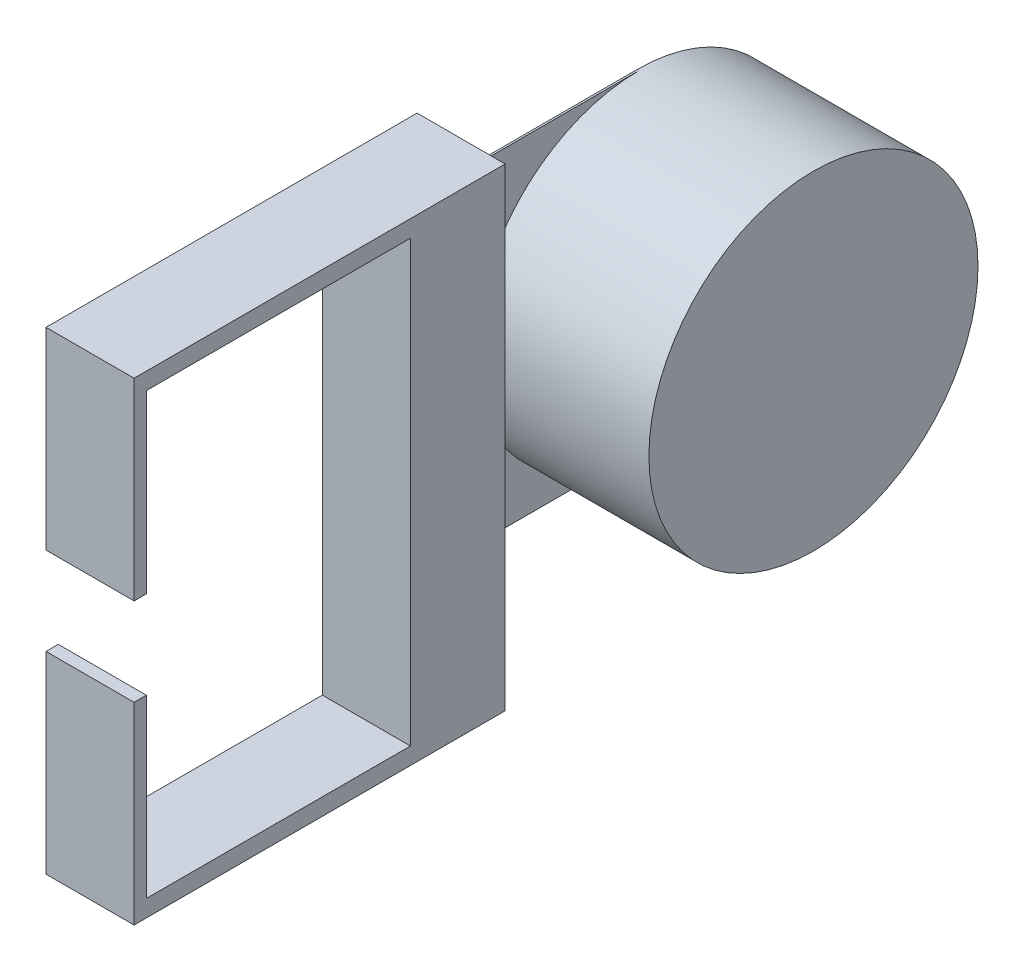
ISO-10303-21;
HEADER;
FILE_DESCRIPTION(('STEP AP214'),'2;1');
FILE_NAME('part.step','',(''),(''),'','','');
FILE_SCHEMA(('AUTOMOTIVE_DESIGN { 1 0 10303 214 1 1 1 1 }'));
ENDSEC;
DATA;
#1=APPLICATION_CONTEXT('core data for automotive mechanical design processes');
#2=APPLICATION_PROTOCOL_DEFINITION('international standard','automotive_design',2000,#1);
#3=PRODUCT_CONTEXT('',#1,'mechanical');
#4=PRODUCT('Part','Part','',(#3));
#5=PRODUCT_RELATED_PRODUCT_CATEGORY('part','',(#4));
#6=PRODUCT_DEFINITION_FORMATION('','',#4);
#7=PRODUCT_DEFINITION_CONTEXT('part definition',#1,'design');
#8=PRODUCT_DEFINITION('design','',#6,#7);
#9=PRODUCT_DEFINITION_SHAPE('','',#8);
#10=(LENGTH_UNIT() NAMED_UNIT(*) SI_UNIT(.MILLI.,.METRE.));
#11=(NAMED_UNIT(*) PLANE_ANGLE_UNIT() SI_UNIT($,.RADIAN.));
#12=(NAMED_UNIT(*) SI_UNIT($,.STERADIAN.) SOLID_ANGLE_UNIT());
#13=UNCERTAINTY_MEASURE_WITH_UNIT(LENGTH_MEASURE(1.E-05),#10,'distance_accuracy_value','');
#14=(GEOMETRIC_REPRESENTATION_CONTEXT(3) GLOBAL_UNCERTAINTY_ASSIGNED_CONTEXT((#13)) GLOBAL_UNIT_ASSIGNED_CONTEXT((#10,
#11,#12)) REPRESENTATION_CONTEXT('',''));
#15=CARTESIAN_POINT('',(0.,0.,0.));
#16=DIRECTION('',(0.,0.,1.));
#17=DIRECTION('',(1.,0.,0.));
#18=AXIS2_PLACEMENT_3D('',#15,#16,#17);
#19=CARTESIAN_POINT('',(25.4,0.,0.));
#20=DIRECTION('',(-1.,0.,0.));
#21=DIRECTION('',(0.,0.,1.));
#22=AXIS2_PLACEMENT_3D('',#19,#20,#21);
#23=CYLINDRICAL_SURFACE('',#22,23.72487);
#24=CARTESIAN_POINT('',(25.4,0.,0.));
#25=DIRECTION('',(1.,0.,0.));
#26=DIRECTION('',(0.,0.,-1.));
#27=AXIS2_PLACEMENT_3D('',#24,#25,#26);
#28=CIRCLE('',#27,23.72487);
#29=CARTESIAN_POINT('',(25.4,0.,-23.72487));
#30=VERTEX_POINT('',#29);
#31=EDGE_CURVE('E48',#30,#30,#28,.T.);
#32=ORIENTED_EDGE('',*,*,#31,.F.);
#33=EDGE_LOOP('',(#32));
#34=FACE_BOUND('',#33,.T.);
#35=DIRECTION('',(-1.,0.,0.));
#36=VECTOR('',#35,1.);
#37=CARTESIAN_POINT('',(0.,23.72487,0.));
#38=LINE('',#37,#36);
#39=CARTESIAN_POINT('',(0.271779999999999,23.72487,0.));
#40=VERTEX_POINT('',#39);
#41=CARTESIAN_POINT('',(0.,23.72487,0.));
#42=VERTEX_POINT('',#41);
#43=EDGE_CURVE('E293',#40,#42,#38,.T.);
#44=ORIENTED_EDGE('',*,*,#43,.F.);
#45=CARTESIAN_POINT('',(0.271779999999999,0.,0.));
#46=DIRECTION('',(-1.,0.,0.));
#47=DIRECTION('',(0.,0.,1.));
#48=AXIS2_PLACEMENT_3D('',#45,#46,#47);
#49=CIRCLE('',#48,23.72487);
#50=CARTESIAN_POINT('',(0.271779999999999,-23.72487,0.));
#51=VERTEX_POINT('',#50);
#52=EDGE_CURVE('E11',#51,#40,#49,.T.);
#53=ORIENTED_EDGE('',*,*,#52,.F.);
#54=DIRECTION('',(1.,0.,0.));
#55=VECTOR('',#54,1.);
#56=CARTESIAN_POINT('',(0.,-23.72487,0.));
#57=LINE('',#56,#55);
#58=CARTESIAN_POINT('',(0.,-23.72487,0.));
#59=VERTEX_POINT('',#58);
#60=EDGE_CURVE('E283',#59,#51,#57,.T.);
#61=ORIENTED_EDGE('',*,*,#60,.F.);
#62=CARTESIAN_POINT('',(0.,0.,0.));
#63=DIRECTION('',(1.,0.,0.));
#64=DIRECTION('',(0.,0.,-1.));
#65=AXIS2_PLACEMENT_3D('',#62,#63,#64);
#66=CIRCLE('',#65,23.72487);
#67=EDGE_CURVE('E322',#59,#42,#66,.T.);
#68=ORIENTED_EDGE('',*,*,#67,.T.);
#69=EDGE_LOOP('',(#44,#53,#61,#68));
#70=FACE_BOUND('',#69,.T.);
#71=ADVANCED_FACE('F37',(#34,#70),#23,.T.);
#72=CARTESIAN_POINT('',(25.4,0.,0.));
#73=DIRECTION('',(1.,0.,0.));
#74=DIRECTION('',(0.,0.,-1.));
#75=AXIS2_PLACEMENT_3D('',#72,#73,#74);
#76=PLANE('',#75);
#77=ORIENTED_EDGE('',*,*,#31,.T.);
#78=EDGE_LOOP('',(#77));
#79=FACE_BOUND('',#78,.T.);
#80=ADVANCED_FACE('F399',(#79),#76,.T.);
#81=CARTESIAN_POINT('',(0.,0.,0.));
#82=DIRECTION('',(1.,0.,0.));
#83=DIRECTION('',(0.,0.,-1.));
#84=AXIS2_PLACEMENT_3D('',#81,#82,#83);
#85=PLANE('',#84);
#86=ORIENTED_EDGE('',*,*,#67,.F.);
#87=DIRECTION('',(0.,0.,-1.));
#88=VECTOR('',#87,1.);
#89=CARTESIAN_POINT('',(0.,-23.72487,31.75));
#90=LINE('',#89,#88);
#91=CARTESIAN_POINT('',(0.,-23.72487,31.75));
#92=VERTEX_POINT('',#91);
#93=EDGE_CURVE('E299',#92,#59,#90,.T.);
#94=ORIENTED_EDGE('',*,*,#93,.F.);
#95=DIRECTION('',(0.,-1.,0.));
#96=VECTOR('',#95,1.);
#97=CARTESIAN_POINT('',(0.,34.14141,31.75));
#98=LINE('',#97,#96);
#99=CARTESIAN_POINT('',(0.,-34.14141,31.75));
#100=VERTEX_POINT('',#99);
#101=EDGE_CURVE('E262',#92,#100,#98,.T.);
#102=ORIENTED_EDGE('',*,*,#101,.T.);
#103=DIRECTION('',(0.,0.,-1.));
#104=VECTOR('',#103,1.);
#105=CARTESIAN_POINT('',(0.,-34.14141,45.40758));
#106=LINE('',#105,#104);
#107=CARTESIAN_POINT('',(0.,-34.14141,85.25256));
#108=VERTEX_POINT('',#107);
#109=EDGE_CURVE('E279',#108,#100,#106,.T.);
#110=ORIENTED_EDGE('',*,*,#109,.F.);
#111=DIRECTION('',(0.,-1.,0.));
#112=VECTOR('',#111,1.);
#113=CARTESIAN_POINT('',(0.,-34.14141,85.25256));
#114=LINE('',#113,#112);
#115=CARTESIAN_POINT('',(0.,-6.32586999999999,85.25256));
#116=VERTEX_POINT('',#115);
#117=EDGE_CURVE('E210',#116,#108,#114,.T.);
#118=ORIENTED_EDGE('',*,*,#117,.F.);
#119=DIRECTION('',(0.,0.,-1.));
#120=VECTOR('',#119,1.);
#121=CARTESIAN_POINT('',(0.,-6.32586999999999,85.25256));
#122=LINE('',#121,#120);
#123=CARTESIAN_POINT('',(0.,-6.32586999999999,83.48218));
#124=VERTEX_POINT('',#123);
#125=EDGE_CURVE('E199',#116,#124,#122,.T.);
#126=ORIENTED_EDGE('',*,*,#125,.T.);
#127=DIRECTION('',(0.,-1.,0.));
#128=VECTOR('',#127,1.);
#129=CARTESIAN_POINT('',(0.,-34.14141,83.48218));
#130=LINE('',#129,#128);
#131=CARTESIAN_POINT('',(0.,-31.70555,83.48218));
#132=VERTEX_POINT('',#131);
#133=EDGE_CURVE('E208',#124,#132,#130,.T.);
#134=ORIENTED_EDGE('',*,*,#133,.T.);
#135=DIRECTION('',(0.,0.,-1.));
#136=VECTOR('',#135,1.);
#137=CARTESIAN_POINT('',(0.,-31.70555,83.48218));
#138=LINE('',#137,#136);
#139=CARTESIAN_POINT('',(0.,-31.70555,45.40758));
#140=VERTEX_POINT('',#139);
#141=EDGE_CURVE('E186',#132,#140,#138,.T.);
#142=ORIENTED_EDGE('',*,*,#141,.T.);
#143=DIRECTION('',(0.,-1.,0.));
#144=VECTOR('',#143,1.);
#145=CARTESIAN_POINT('',(0.,34.14141,45.40758));
#146=LINE('',#145,#144);
#147=CARTESIAN_POINT('',(0.,31.70555,45.40758));
#148=VERTEX_POINT('',#147);
#149=EDGE_CURVE('E249',#148,#140,#146,.T.);
#150=ORIENTED_EDGE('',*,*,#149,.F.);
#151=DIRECTION('',(0.,0.,-1.));
#152=VECTOR('',#151,1.);
#153=CARTESIAN_POINT('',(0.,31.70555,83.48218));
#154=LINE('',#153,#152);
#155=CARTESIAN_POINT('',(0.,31.70555,83.48218));
#156=VERTEX_POINT('',#155);
#157=EDGE_CURVE('E236',#156,#148,#154,.T.);
#158=ORIENTED_EDGE('',*,*,#157,.F.);
#159=DIRECTION('',(0.,-1.,0.));
#160=VECTOR('',#159,1.);
#161=CARTESIAN_POINT('',(0.,34.14141,83.48218));
#162=LINE('',#161,#160);
#163=CARTESIAN_POINT('',(0.,6.32586999999999,83.48218));
#164=VERTEX_POINT('',#163);
#165=EDGE_CURVE('E179',#156,#164,#162,.T.);
#166=ORIENTED_EDGE('',*,*,#165,.T.);
#167=DIRECTION('',(0.,0.,-1.));
#168=VECTOR('',#167,1.);
#169=CARTESIAN_POINT('',(0.,6.32586999999999,85.25256));
#170=LINE('',#169,#168);
#171=CARTESIAN_POINT('',(0.,6.32586999999999,85.25256));
#172=VERTEX_POINT('',#171);
#173=EDGE_CURVE('E159',#172,#164,#170,.T.);
#174=ORIENTED_EDGE('',*,*,#173,.F.);
#175=DIRECTION('',(0.,-1.,0.));
#176=VECTOR('',#175,1.);
#177=CARTESIAN_POINT('',(0.,34.14141,85.25256));
#178=LINE('',#177,#176);
#179=CARTESIAN_POINT('',(0.,34.14141,85.25256));
#180=VERTEX_POINT('',#179);
#181=EDGE_CURVE('E165',#180,#172,#178,.T.);
#182=ORIENTED_EDGE('',*,*,#181,.F.);
#183=DIRECTION('',(0.,0.,-1.));
#184=VECTOR('',#183,1.);
#185=CARTESIAN_POINT('',(0.,34.14141,45.40758));
#186=LINE('',#185,#184);
#187=CARTESIAN_POINT('',(0.,34.14141,31.75));
#188=VERTEX_POINT('',#187);
#189=EDGE_CURVE('E285',#180,#188,#186,.T.);
#190=ORIENTED_EDGE('',*,*,#189,.T.);
#191=CARTESIAN_POINT('',(0.,23.72487,31.75));
#192=VERTEX_POINT('',#191);
#193=EDGE_CURVE('E265',#188,#192,#98,.T.);
#194=ORIENTED_EDGE('',*,*,#193,.T.);
#195=DIRECTION('',(0.,0.,-1.));
#196=VECTOR('',#195,1.);
#197=CARTESIAN_POINT('',(0.,23.72487,31.75));
#198=LINE('',#197,#196);
#199=EDGE_CURVE('E307',#192,#42,#198,.T.);
#200=ORIENTED_EDGE('',*,*,#199,.T.);
#201=EDGE_LOOP('',(#86,#94,#102,#110,#118,#126,#134,#142,#150,#158,#166,#174,#182,#190,#194,#200));
#202=FACE_BOUND('',#201,.T.);
#203=ADVANCED_FACE('F180',(#202),#85,.F.);
#204=CARTESIAN_POINT('',(0.,-23.72487,31.75));
#205=DIRECTION('',(0.,1.,0.));
#206=DIRECTION('',(0.,0.,1.));
#207=AXIS2_PLACEMENT_3D('',#204,#205,#206);
#208=PLANE('',#207);
#209=ORIENTED_EDGE('',*,*,#60,.T.);
#210=DIRECTION('',(0.,0.,-1.));
#211=VECTOR('',#210,1.);
#212=CARTESIAN_POINT('',(0.271779999999999,-23.72487,31.75));
#213=LINE('',#212,#211);
#214=CARTESIAN_POINT('',(0.271779999999999,-23.72487,31.75));
#215=VERTEX_POINT('',#214);
#216=EDGE_CURVE('E320',#215,#51,#213,.T.);
#217=ORIENTED_EDGE('',*,*,#216,.F.);
#218=DIRECTION('',(1.,0.,0.));
#219=VECTOR('',#218,1.);
#220=CARTESIAN_POINT('',(0.,-23.72487,31.75));
#221=LINE('',#220,#219);
#222=EDGE_CURVE('E289',#92,#215,#221,.T.);
#223=ORIENTED_EDGE('',*,*,#222,.F.);
#224=ORIENTED_EDGE('',*,*,#93,.T.);
#225=EDGE_LOOP('',(#209,#217,#223,#224));
#226=FACE_BOUND('',#225,.T.);
#227=ADVANCED_FACE('F338',(#226),#208,.F.);
#228=CARTESIAN_POINT('',(0.271779999999999,-23.72487,31.75));
#229=DIRECTION('',(-1.,0.,0.));
#230=DIRECTION('',(0.,0.,1.));
#231=AXIS2_PLACEMENT_3D('',#228,#229,#230);
#232=PLANE('',#231);
#233=ORIENTED_EDGE('',*,*,#216,.T.);
#234=ORIENTED_EDGE('',*,*,#52,.T.);
#235=DIRECTION('',(0.,0.,-1.));
#236=VECTOR('',#235,1.);
#237=CARTESIAN_POINT('',(0.271779999999999,23.72487,31.75));
#238=LINE('',#237,#236);
#239=CARTESIAN_POINT('',(0.271779999999999,23.72487,31.75));
#240=VERTEX_POINT('',#239);
#241=EDGE_CURVE('E312',#240,#40,#238,.T.);
#242=ORIENTED_EDGE('',*,*,#241,.F.);
#243=DIRECTION('',(0.,1.,0.));
#244=VECTOR('',#243,1.);
#245=CARTESIAN_POINT('',(0.271779999999999,-23.72487,31.75));
#246=LINE('',#245,#244);
#247=EDGE_CURVE('E287',#215,#240,#246,.T.);
#248=ORIENTED_EDGE('',*,*,#247,.F.);
#249=EDGE_LOOP('',(#233,#234,#242,#248));
#250=FACE_BOUND('',#249,.T.);
#251=ADVANCED_FACE('F336',(#250),#232,.F.);
#252=CARTESIAN_POINT('',(0.,23.72487,31.75));
#253=DIRECTION('',(0.,-1.,0.));
#254=DIRECTION('',(0.,0.,-1.));
#255=AXIS2_PLACEMENT_3D('',#252,#253,#254);
#256=PLANE('',#255);
#257=ORIENTED_EDGE('',*,*,#43,.T.);
#258=ORIENTED_EDGE('',*,*,#199,.F.);
#259=DIRECTION('',(-1.,0.,0.));
#260=VECTOR('',#259,1.);
#261=CARTESIAN_POINT('',(0.,23.72487,31.75));
#262=LINE('',#261,#260);
#263=EDGE_CURVE('E294',#240,#192,#262,.T.);
#264=ORIENTED_EDGE('',*,*,#263,.F.);
#265=ORIENTED_EDGE('',*,*,#241,.T.);
#266=EDGE_LOOP('',(#257,#258,#264,#265));
#267=FACE_BOUND('',#266,.T.);
#268=ADVANCED_FACE('F329',(#267),#256,.F.);
#269=CARTESIAN_POINT('',(0.,0.,31.75));
#270=DIRECTION('',(0.,0.,1.));
#271=DIRECTION('',(1.,0.,0.));
#272=AXIS2_PLACEMENT_3D('',#269,#270,#271);
#273=PLANE('',#272);
#274=ORIENTED_EDGE('',*,*,#101,.F.);
#275=ORIENTED_EDGE('',*,*,#222,.T.);
#276=ORIENTED_EDGE('',*,*,#247,.T.);
#277=ORIENTED_EDGE('',*,*,#263,.T.);
#278=ORIENTED_EDGE('',*,*,#193,.F.);
#279=DIRECTION('',(-1.,0.,0.));
#280=VECTOR('',#279,1.);
#281=CARTESIAN_POINT('',(12.7,34.14141,31.75));
#282=LINE('',#281,#280);
#283=CARTESIAN_POINT('',(12.7,34.14141,31.75));
#284=VERTEX_POINT('',#283);
#285=EDGE_CURVE('E237',#284,#188,#282,.T.);
#286=ORIENTED_EDGE('',*,*,#285,.F.);
#287=DIRECTION('',(0.,1.,0.));
#288=VECTOR('',#287,1.);
#289=CARTESIAN_POINT('',(12.7,-34.14141,31.75));
#290=LINE('',#289,#288);
#291=CARTESIAN_POINT('',(12.7,-34.14141,31.75));
#292=VERTEX_POINT('',#291);
#293=EDGE_CURVE('E251',#292,#284,#290,.T.);
#294=ORIENTED_EDGE('',*,*,#293,.F.);
#295=DIRECTION('',(1.,0.,0.));
#296=VECTOR('',#295,1.);
#297=CARTESIAN_POINT('',(0.,-34.14141,31.75));
#298=LINE('',#297,#296);
#299=EDGE_CURVE('E269',#100,#292,#298,.T.);
#300=ORIENTED_EDGE('',*,*,#299,.F.);
#301=EDGE_LOOP('',(#274,#275,#276,#277,#278,#286,#294,#300));
#302=FACE_BOUND('',#301,.T.);
#303=ADVANCED_FACE('F335',(#302),#273,.F.);
#304=CARTESIAN_POINT('',(12.7,34.14141,45.40758));
#305=DIRECTION('',(0.,-1.,0.));
#306=DIRECTION('',(1.,0.,0.));
#307=AXIS2_PLACEMENT_3D('',#304,#305,#306);
#308=PLANE('',#307);
#309=ORIENTED_EDGE('',*,*,#285,.T.);
#310=ORIENTED_EDGE('',*,*,#189,.F.);
#311=DIRECTION('',(-1.,0.,0.));
#312=VECTOR('',#311,1.);
#313=CARTESIAN_POINT('',(0.,34.14141,85.25256));
#314=LINE('',#313,#312);
#315=CARTESIAN_POINT('',(12.7,34.14141,85.25256));
#316=VERTEX_POINT('',#315);
#317=EDGE_CURVE('E167',#316,#180,#314,.T.);
#318=ORIENTED_EDGE('',*,*,#317,.F.);
#319=DIRECTION('',(0.,0.,-1.));
#320=VECTOR('',#319,1.);
#321=CARTESIAN_POINT('',(12.7,34.14141,45.40758));
#322=LINE('',#321,#320);
#323=EDGE_CURVE('E260',#316,#284,#322,.T.);
#324=ORIENTED_EDGE('',*,*,#323,.T.);
#325=EDGE_LOOP('',(#309,#310,#318,#324));
#326=FACE_BOUND('',#325,.T.);
#327=ADVANCED_FACE('F354',(#326),#308,.F.);
#328=CARTESIAN_POINT('',(0.,-34.14141,45.40758));
#329=DIRECTION('',(0.,1.,0.));
#330=DIRECTION('',(-1.,0.,0.));
#331=AXIS2_PLACEMENT_3D('',#328,#329,#330);
#332=PLANE('',#331);
#333=ORIENTED_EDGE('',*,*,#299,.T.);
#334=DIRECTION('',(0.,0.,-1.));
#335=VECTOR('',#334,1.);
#336=CARTESIAN_POINT('',(12.7,-34.14141,45.40758));
#337=LINE('',#336,#335);
#338=CARTESIAN_POINT('',(12.7,-34.14141,85.25256));
#339=VERTEX_POINT('',#338);
#340=EDGE_CURVE('E274',#339,#292,#337,.T.);
#341=ORIENTED_EDGE('',*,*,#340,.F.);
#342=DIRECTION('',(1.,0.,0.));
#343=VECTOR('',#342,1.);
#344=CARTESIAN_POINT('',(0.,-34.14141,85.25256));
#345=LINE('',#344,#343);
#346=EDGE_CURVE('E216',#108,#339,#345,.T.);
#347=ORIENTED_EDGE('',*,*,#346,.F.);
#348=ORIENTED_EDGE('',*,*,#109,.T.);
#349=EDGE_LOOP('',(#333,#341,#347,#348));
#350=FACE_BOUND('',#349,.T.);
#351=ADVANCED_FACE('F347',(#350),#332,.F.);
#352=CARTESIAN_POINT('',(12.7,-34.14141,45.40758));
#353=DIRECTION('',(-1.,0.,0.));
#354=DIRECTION('',(0.,0.,1.));
#355=AXIS2_PLACEMENT_3D('',#352,#353,#354);
#356=PLANE('',#355);
#357=ORIENTED_EDGE('',*,*,#293,.T.);
#358=ORIENTED_EDGE('',*,*,#323,.F.);
#359=DIRECTION('',(0.,1.,0.));
#360=VECTOR('',#359,1.);
#361=CARTESIAN_POINT('',(12.7,34.14141,85.25256));
#362=LINE('',#361,#360);
#363=CARTESIAN_POINT('',(12.7,6.32586999999999,85.25256));
#364=VERTEX_POINT('',#363);
#365=EDGE_CURVE('E161',#364,#316,#362,.T.);
#366=ORIENTED_EDGE('',*,*,#365,.F.);
#367=DIRECTION('',(0.,0.,-1.));
#368=VECTOR('',#367,1.);
#369=CARTESIAN_POINT('',(12.7,6.32586999999999,85.25256));
#370=LINE('',#369,#368);
#371=CARTESIAN_POINT('',(12.7,6.32586999999999,83.48218));
#372=VERTEX_POINT('',#371);
#373=EDGE_CURVE('E160',#364,#372,#370,.T.);
#374=ORIENTED_EDGE('',*,*,#373,.T.);
#375=DIRECTION('',(0.,1.,0.));
#376=VECTOR('',#375,1.);
#377=CARTESIAN_POINT('',(12.7,34.14141,83.48218));
#378=LINE('',#377,#376);
#379=CARTESIAN_POINT('',(12.7,31.70555,83.48218));
#380=VERTEX_POINT('',#379);
#381=EDGE_CURVE('E172',#372,#380,#378,.T.);
#382=ORIENTED_EDGE('',*,*,#381,.T.);
#383=DIRECTION('',(0.,0.,-1.));
#384=VECTOR('',#383,1.);
#385=CARTESIAN_POINT('',(12.7,31.70555,83.48218));
#386=LINE('',#385,#384);
#387=CARTESIAN_POINT('',(12.7,31.70555,45.40758));
#388=VERTEX_POINT('',#387);
#389=EDGE_CURVE('E229',#380,#388,#386,.T.);
#390=ORIENTED_EDGE('',*,*,#389,.T.);
#391=DIRECTION('',(0.,1.,0.));
#392=VECTOR('',#391,1.);
#393=CARTESIAN_POINT('',(12.7,-34.14141,45.40758));
#394=LINE('',#393,#392);
#395=CARTESIAN_POINT('',(12.7,-31.70555,45.40758));
#396=VERTEX_POINT('',#395);
#397=EDGE_CURVE('E254',#396,#388,#394,.T.);
#398=ORIENTED_EDGE('',*,*,#397,.F.);
#399=DIRECTION('',(0.,0.,-1.));
#400=VECTOR('',#399,1.);
#401=CARTESIAN_POINT('',(12.7,-31.70555,83.48218));
#402=LINE('',#401,#400);
#403=CARTESIAN_POINT('',(12.7,-31.70555,83.48218));
#404=VERTEX_POINT('',#403);
#405=EDGE_CURVE('E182',#404,#396,#402,.T.);
#406=ORIENTED_EDGE('',*,*,#405,.F.);
#407=DIRECTION('',(0.,1.,0.));
#408=VECTOR('',#407,1.);
#409=CARTESIAN_POINT('',(12.7,-34.14141,83.48218));
#410=LINE('',#409,#408);
#411=CARTESIAN_POINT('',(12.7,-6.32586999999999,83.48218));
#412=VERTEX_POINT('',#411);
#413=EDGE_CURVE('E207',#404,#412,#410,.T.);
#414=ORIENTED_EDGE('',*,*,#413,.T.);
#415=DIRECTION('',(0.,0.,-1.));
#416=VECTOR('',#415,1.);
#417=CARTESIAN_POINT('',(12.7,-6.32586999999999,85.25256));
#418=LINE('',#417,#416);
#419=CARTESIAN_POINT('',(12.7,-6.32586999999999,85.25256));
#420=VERTEX_POINT('',#419);
#421=EDGE_CURVE('E191',#420,#412,#418,.T.);
#422=ORIENTED_EDGE('',*,*,#421,.F.);
#423=DIRECTION('',(0.,1.,0.));
#424=VECTOR('',#423,1.);
#425=CARTESIAN_POINT('',(12.7,-34.14141,85.25256));
#426=LINE('',#425,#424);
#427=EDGE_CURVE('E217',#339,#420,#426,.T.);
#428=ORIENTED_EDGE('',*,*,#427,.F.);
#429=ORIENTED_EDGE('',*,*,#340,.T.);
#430=EDGE_LOOP('',(#357,#358,#366,#374,#382,#390,#398,#406,#414,#422,#428,#429));
#431=FACE_BOUND('',#430,.T.);
#432=ADVANCED_FACE('F349',(#431),#356,.F.);
#433=CARTESIAN_POINT('',(0.,0.,45.40758));
#434=DIRECTION('',(0.,0.,1.));
#435=DIRECTION('',(1.,0.,0.));
#436=AXIS2_PLACEMENT_3D('',#433,#434,#435);
#437=PLANE('',#436);
#438=DIRECTION('',(1.,0.,0.));
#439=VECTOR('',#438,1.);
#440=CARTESIAN_POINT('',(0.,31.70555,45.40758));
#441=LINE('',#440,#439);
#442=EDGE_CURVE('E58',#148,#388,#441,.T.);
#443=ORIENTED_EDGE('',*,*,#442,.F.);
#444=ORIENTED_EDGE('',*,*,#149,.T.);
#445=DIRECTION('',(-1.,0.,0.));
#446=VECTOR('',#445,1.);
#447=CARTESIAN_POINT('',(0.,-31.70555,45.40758));
#448=LINE('',#447,#446);
#449=EDGE_CURVE('E54',#396,#140,#448,.T.);
#450=ORIENTED_EDGE('',*,*,#449,.F.);
#451=ORIENTED_EDGE('',*,*,#397,.T.);
#452=EDGE_LOOP('',(#443,#444,#450,#451));
#453=FACE_BOUND('',#452,.T.);
#454=ADVANCED_FACE('F369',(#453),#437,.T.);
#455=CARTESIAN_POINT('',(0.,-31.70555,83.48218));
#456=DIRECTION('',(0.,-1.,0.));
#457=DIRECTION('',(0.,0.,-1.));
#458=AXIS2_PLACEMENT_3D('',#455,#456,#457);
#459=PLANE('',#458);
#460=ORIENTED_EDGE('',*,*,#449,.T.);
#461=ORIENTED_EDGE('',*,*,#141,.F.);
#462=DIRECTION('',(-1.,0.,0.));
#463=VECTOR('',#462,1.);
#464=CARTESIAN_POINT('',(0.,-31.70555,83.48218));
#465=LINE('',#464,#463);
#466=EDGE_CURVE('E242',#404,#132,#465,.T.);
#467=ORIENTED_EDGE('',*,*,#466,.F.);
#468=ORIENTED_EDGE('',*,*,#405,.T.);
#469=EDGE_LOOP('',(#460,#461,#467,#468));
#470=FACE_BOUND('',#469,.T.);
#471=ADVANCED_FACE('F375',(#470),#459,.F.);
#472=CARTESIAN_POINT('',(0.,31.70555,83.48218));
#473=DIRECTION('',(0.,1.,0.));
#474=DIRECTION('',(0.,0.,1.));
#475=AXIS2_PLACEMENT_3D('',#472,#473,#474);
#476=PLANE('',#475);
#477=ORIENTED_EDGE('',*,*,#442,.T.);
#478=ORIENTED_EDGE('',*,*,#389,.F.);
#479=DIRECTION('',(1.,0.,0.));
#480=VECTOR('',#479,1.);
#481=CARTESIAN_POINT('',(0.,31.70555,83.48218));
#482=LINE('',#481,#480);
#483=EDGE_CURVE('E228',#156,#380,#482,.T.);
#484=ORIENTED_EDGE('',*,*,#483,.F.);
#485=ORIENTED_EDGE('',*,*,#157,.T.);
#486=EDGE_LOOP('',(#477,#478,#484,#485));
#487=FACE_BOUND('',#486,.T.);
#488=ADVANCED_FACE('F367',(#487),#476,.F.);
#489=CARTESIAN_POINT('',(0.,0.,83.48218));
#490=DIRECTION('',(0.,0.,1.));
#491=DIRECTION('',(1.,0.,0.));
#492=AXIS2_PLACEMENT_3D('',#489,#490,#491);
#493=PLANE('',#492);
#494=ORIENTED_EDGE('',*,*,#165,.F.);
#495=ORIENTED_EDGE('',*,*,#483,.T.);
#496=ORIENTED_EDGE('',*,*,#381,.F.);
#497=DIRECTION('',(1.,0.,0.));
#498=VECTOR('',#497,1.);
#499=CARTESIAN_POINT('',(0.,6.32586999999999,83.48218));
#500=LINE('',#499,#498);
#501=EDGE_CURVE('E359',#164,#372,#500,.T.);
#502=ORIENTED_EDGE('',*,*,#501,.F.);
#503=EDGE_LOOP('',(#494,#495,#496,#502));
#504=FACE_BOUND('',#503,.T.);
#505=ADVANCED_FACE('F370',(#504),#493,.F.);
#506=CARTESIAN_POINT('',(0.,6.32586999999999,85.25256));
#507=DIRECTION('',(0.,1.,0.));
#508=DIRECTION('',(0.,0.,1.));
#509=AXIS2_PLACEMENT_3D('',#506,#507,#508);
#510=PLANE('',#509);
#511=ORIENTED_EDGE('',*,*,#501,.T.);
#512=ORIENTED_EDGE('',*,*,#373,.F.);
#513=DIRECTION('',(1.,0.,0.));
#514=VECTOR('',#513,1.);
#515=CARTESIAN_POINT('',(0.,6.32586999999999,85.25256));
#516=LINE('',#515,#514);
#517=EDGE_CURVE('E155',#172,#364,#516,.T.);
#518=ORIENTED_EDGE('',*,*,#517,.F.);
#519=ORIENTED_EDGE('',*,*,#173,.T.);
#520=EDGE_LOOP('',(#511,#512,#518,#519));
#521=FACE_BOUND('',#520,.T.);
#522=ADVANCED_FACE('F151',(#521),#510,.F.);
#523=CARTESIAN_POINT('',(0.,0.,85.25256));
#524=DIRECTION('',(0.,0.,1.));
#525=DIRECTION('',(1.,0.,0.));
#526=AXIS2_PLACEMENT_3D('',#523,#524,#525);
#527=PLANE('',#526);
#528=ORIENTED_EDGE('',*,*,#181,.T.);
#529=ORIENTED_EDGE('',*,*,#517,.T.);
#530=ORIENTED_EDGE('',*,*,#365,.T.);
#531=ORIENTED_EDGE('',*,*,#317,.T.);
#532=EDGE_LOOP('',(#528,#529,#530,#531));
#533=FACE_BOUND('',#532,.T.);
#534=ADVANCED_FACE('F166',(#533),#527,.T.);
#535=CARTESIAN_POINT('',(0.,-6.32586999999999,85.25256));
#536=DIRECTION('',(0.,-1.,0.));
#537=DIRECTION('',(0.,0.,-1.));
#538=AXIS2_PLACEMENT_3D('',#535,#536,#537);
#539=PLANE('',#538);
#540=DIRECTION('',(-1.,0.,0.));
#541=VECTOR('',#540,1.);
#542=CARTESIAN_POINT('',(0.,-6.32586999999999,83.48218));
#543=LINE('',#542,#541);
#544=EDGE_CURVE('E205',#412,#124,#543,.T.);
#545=ORIENTED_EDGE('',*,*,#544,.T.);
#546=ORIENTED_EDGE('',*,*,#125,.F.);
#547=DIRECTION('',(-1.,0.,0.));
#548=VECTOR('',#547,1.);
#549=CARTESIAN_POINT('',(0.,-6.32586999999999,85.25256));
#550=LINE('',#549,#548);
#551=EDGE_CURVE('E201',#420,#116,#550,.T.);
#552=ORIENTED_EDGE('',*,*,#551,.F.);
#553=ORIENTED_EDGE('',*,*,#421,.T.);
#554=EDGE_LOOP('',(#545,#546,#552,#553));
#555=FACE_BOUND('',#554,.T.);
#556=ADVANCED_FACE('F379',(#555),#539,.F.);
#557=CARTESIAN_POINT('',(0.,0.,85.25256));
#558=DIRECTION('',(0.,0.,-1.));
#559=DIRECTION('',(-1.,0.,0.));
#560=AXIS2_PLACEMENT_3D('',#557,#558,#559);
#561=PLANE('',#560);
#562=ORIENTED_EDGE('',*,*,#117,.T.);
#563=ORIENTED_EDGE('',*,*,#346,.T.);
#564=ORIENTED_EDGE('',*,*,#427,.T.);
#565=ORIENTED_EDGE('',*,*,#551,.T.);
#566=EDGE_LOOP('',(#562,#563,#564,#565));
#567=FACE_BOUND('',#566,.T.);
#568=ADVANCED_FACE('F383',(#567),#561,.F.);
#569=CARTESIAN_POINT('',(0.,0.,83.48218));
#570=DIRECTION('',(0.,0.,-1.));
#571=DIRECTION('',(-1.,0.,0.));
#572=AXIS2_PLACEMENT_3D('',#569,#570,#571);
#573=PLANE('',#572);
#574=ORIENTED_EDGE('',*,*,#413,.F.);
#575=ORIENTED_EDGE('',*,*,#466,.T.);
#576=ORIENTED_EDGE('',*,*,#133,.F.);
#577=ORIENTED_EDGE('',*,*,#544,.F.);
#578=EDGE_LOOP('',(#574,#575,#576,#577));
#579=FACE_BOUND('',#578,.T.);
#580=ADVANCED_FACE('F384',(#579),#573,.T.);
#581=CLOSED_SHELL('',(#71,#80,#203,#227,#251,#268,#303,#327,#351,#432,#454,#471,#488,#505,#522,
#534,#556,#568,#580));
#582=MANIFOLD_SOLID_BREP('B2',#581);
#583=ADVANCED_BREP_SHAPE_REPRESENTATION('',(#18,#582),#14);
#584=SHAPE_DEFINITION_REPRESENTATION(#9,#583);
ENDSEC;
END-ISO-10303-21;
